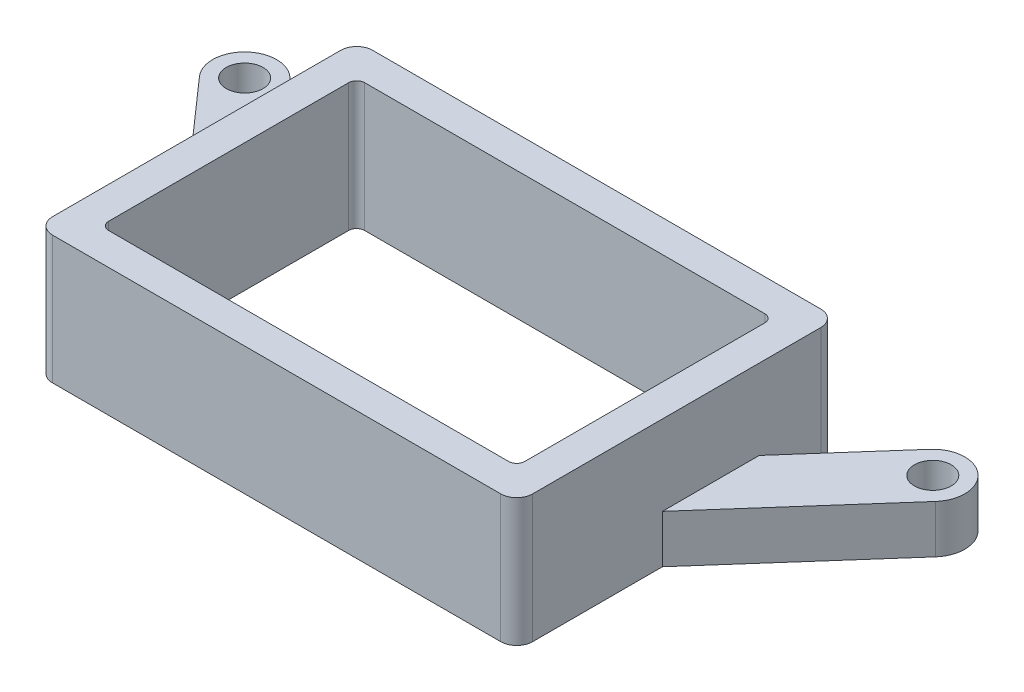
ISO-10303-21;
HEADER;
FILE_DESCRIPTION(('STEP AP214'),'2;1');
FILE_NAME('part.step','',(''),(''),'','','');
FILE_SCHEMA(('AUTOMOTIVE_DESIGN { 1 0 10303 214 1 1 1 1 }'));
ENDSEC;
DATA;
#1=APPLICATION_CONTEXT('core data for automotive mechanical design processes');
#2=APPLICATION_PROTOCOL_DEFINITION('international standard','automotive_design',2000,#1);
#3=PRODUCT_CONTEXT('',#1,'mechanical');
#4=PRODUCT('Part','Part','',(#3));
#5=PRODUCT_RELATED_PRODUCT_CATEGORY('part','',(#4));
#6=PRODUCT_DEFINITION_FORMATION('','',#4);
#7=PRODUCT_DEFINITION_CONTEXT('part definition',#1,'design');
#8=PRODUCT_DEFINITION('design','',#6,#7);
#9=PRODUCT_DEFINITION_SHAPE('','',#8);
#10=(LENGTH_UNIT() NAMED_UNIT(*) SI_UNIT(.MILLI.,.METRE.));
#11=(NAMED_UNIT(*) PLANE_ANGLE_UNIT() SI_UNIT($,.RADIAN.));
#12=(NAMED_UNIT(*) SI_UNIT($,.STERADIAN.) SOLID_ANGLE_UNIT());
#13=UNCERTAINTY_MEASURE_WITH_UNIT(LENGTH_MEASURE(1.E-05),#10,'distance_accuracy_value','');
#14=(GEOMETRIC_REPRESENTATION_CONTEXT(3) GLOBAL_UNCERTAINTY_ASSIGNED_CONTEXT((#13)) GLOBAL_UNIT_ASSIGNED_CONTEXT((#10,
#11,#12)) REPRESENTATION_CONTEXT('',''));
#15=CARTESIAN_POINT('',(0.,0.,0.));
#16=DIRECTION('',(0.,0.,1.));
#17=DIRECTION('',(1.,0.,0.));
#18=AXIS2_PLACEMENT_3D('',#15,#16,#17);
#19=CARTESIAN_POINT('',(0.,3.,0.));
#20=DIRECTION('',(0.,1.,0.));
#21=DIRECTION('',(0.,0.,1.));
#22=AXIS2_PLACEMENT_3D('',#19,#20,#21);
#23=PLANE('',#22);
#24=DIRECTION('',(0.,0.,-1.));
#25=VECTOR('',#24,1.);
#26=CARTESIAN_POINT('',(15.,3.,10.));
#27=LINE('',#26,#25);
#28=CARTESIAN_POINT('',(15.,3.,0.894023007753725));
#29=VERTEX_POINT('',#28);
#30=CARTESIAN_POINT('',(15.,3.,-5.15340856039392));
#31=VERTEX_POINT('',#30);
#32=EDGE_CURVE('E204',#29,#31,#27,.T.);
#33=ORIENTED_EDGE('',*,*,#32,.F.);
#34=DIRECTION('',(0.661437827766149,0.,-0.749999999999999));
#35=VECTOR('',#34,1.);
#36=CARTESIAN_POINT('',(8.88100547716616,3.,7.83231062826142));
#37=LINE('',#36,#35);
#38=CARTESIAN_POINT('',(23.,3.,-8.1771243444677));
#39=VERTEX_POINT('',#38);
#40=EDGE_CURVE('E207',#29,#39,#37,.T.);
#41=ORIENTED_EDGE('',*,*,#40,.T.);
#42=CARTESIAN_POINT('',(21.5,3.,-9.5));
#43=DIRECTION('',(0.,1.,0.));
#44=DIRECTION('',(0.,0.,1.));
#45=AXIS2_PLACEMENT_3D('',#42,#43,#44);
#46=CIRCLE('',#45,2.);
#47=CARTESIAN_POINT('',(20.,3.,-10.8228756555323));
#48=VERTEX_POINT('',#47);
#49=EDGE_CURVE('E226',#39,#48,#46,.T.);
#50=ORIENTED_EDGE('',*,*,#49,.T.);
#51=DIRECTION('',(0.661437827766149,0.,-0.749999999999999));
#52=VECTOR('',#51,1.);
#53=CARTESIAN_POINT('',(5.88100547716615,3.,5.18655931719682));
#54=LINE('',#53,#52);
#55=EDGE_CURVE('E210',#31,#48,#54,.T.);
#56=ORIENTED_EDGE('',*,*,#55,.F.);
#57=EDGE_LOOP('',(#33,#41,#50,#56));
#58=FACE_BOUND('',#57,.T.);
#59=CARTESIAN_POINT('',(21.5,3.,-9.5));
#60=DIRECTION('',(0.,1.,0.));
#61=DIRECTION('',(0.,0.,1.));
#62=AXIS2_PLACEMENT_3D('',#59,#60,#61);
#63=CIRCLE('',#62,1.14999999999999);
#64=CARTESIAN_POINT('',(21.5,3.,-8.35000000000001));
#65=VERTEX_POINT('',#64);
#66=EDGE_CURVE('E412',#65,#65,#63,.F.);
#67=ORIENTED_EDGE('',*,*,#66,.T.);
#68=EDGE_LOOP('',(#67));
#69=FACE_BOUND('',#68,.T.);
#70=ADVANCED_FACE('F41',(#58,#69),#23,.T.);
#71=CARTESIAN_POINT('',(0.,3.,10.));
#72=DIRECTION('',(0.,0.,1.));
#73=DIRECTION('',(1.,0.,0.));
#74=AXIS2_PLACEMENT_3D('',#71,#72,#73);
#75=PLANE('',#74);
#76=DIRECTION('',(-1.,0.,0.));
#77=VECTOR('',#76,1.);
#78=CARTESIAN_POINT('',(0.,0.,10.));
#79=LINE('',#78,#77);
#80=CARTESIAN_POINT('',(14.,0.,10.));
#81=VERTEX_POINT('',#80);
#82=CARTESIAN_POINT('',(-14.,0.,10.));
#83=VERTEX_POINT('',#82);
#84=EDGE_CURVE('E426',#81,#83,#79,.T.);
#85=ORIENTED_EDGE('',*,*,#84,.F.);
#86=DIRECTION('',(0.,-1.,0.));
#87=VECTOR('',#86,1.);
#88=CARTESIAN_POINT('',(14.,8.,10.));
#89=LINE('',#88,#87);
#90=CARTESIAN_POINT('',(14.,8.,10.));
#91=VERTEX_POINT('',#90);
#92=EDGE_CURVE('E265',#81,#91,#89,.F.);
#93=ORIENTED_EDGE('',*,*,#92,.T.);
#94=DIRECTION('',(1.,0.,0.));
#95=VECTOR('',#94,1.);
#96=CARTESIAN_POINT('',(15.,8.,10.));
#97=LINE('',#96,#95);
#98=CARTESIAN_POINT('',(-14.,8.,10.));
#99=VERTEX_POINT('',#98);
#100=EDGE_CURVE('E389',#99,#91,#97,.T.);
#101=ORIENTED_EDGE('',*,*,#100,.F.);
#102=DIRECTION('',(0.,-1.,0.));
#103=VECTOR('',#102,1.);
#104=CARTESIAN_POINT('',(-14.,3.,10.));
#105=LINE('',#104,#103);
#106=EDGE_CURVE('E261',#99,#83,#105,.T.);
#107=ORIENTED_EDGE('',*,*,#106,.T.);
#108=EDGE_LOOP('',(#85,#93,#101,#107));
#109=FACE_BOUND('',#108,.T.);
#110=ADVANCED_FACE('F541',(#109),#75,.T.);
#111=CARTESIAN_POINT('',(8.88100547716616,3.,7.83231062826142));
#112=DIRECTION('',(-0.749999999999999,0.,-0.661437827766149));
#113=DIRECTION('',(-0.661437827766149,0.,0.749999999999999));
#114=AXIS2_PLACEMENT_3D('',#111,#112,#113);
#115=PLANE('',#114);
#116=DIRECTION('',(0.661437827766149,0.,-0.749999999999999));
#117=VECTOR('',#116,1.);
#118=CARTESIAN_POINT('',(8.88100547716616,0.,7.83231062826142));
#119=LINE('',#118,#117);
#120=CARTESIAN_POINT('',(15.,0.,0.894023007753727));
#121=VERTEX_POINT('',#120);
#122=CARTESIAN_POINT('',(23.,0.,-8.1771243444677));
#123=VERTEX_POINT('',#122);
#124=EDGE_CURVE('E432',#121,#123,#119,.T.);
#125=ORIENTED_EDGE('',*,*,#124,.T.);
#126=DIRECTION('',(0.,-1.,0.));
#127=VECTOR('',#126,1.);
#128=CARTESIAN_POINT('',(23.,3.,-8.1771243444677));
#129=LINE('',#128,#127);
#130=EDGE_CURVE('E224',#39,#123,#129,.T.);
#131=ORIENTED_EDGE('',*,*,#130,.F.);
#132=ORIENTED_EDGE('',*,*,#40,.F.);
#133=DIRECTION('',(0.,-1.,0.));
#134=VECTOR('',#133,1.);
#135=CARTESIAN_POINT('',(15.,3.,0.894023007753727));
#136=LINE('',#135,#134);
#137=EDGE_CURVE('E222',#29,#121,#136,.T.);
#138=ORIENTED_EDGE('',*,*,#137,.T.);
#139=EDGE_LOOP('',(#125,#131,#132,#138));
#140=FACE_BOUND('',#139,.T.);
#141=ADVANCED_FACE('F221',(#140),#115,.F.);
#142=CARTESIAN_POINT('',(21.5,3.,-9.5));
#143=DIRECTION('',(0.,-1.,0.));
#144=DIRECTION('',(0.,0.,-1.));
#145=AXIS2_PLACEMENT_3D('',#142,#143,#144);
#146=CYLINDRICAL_SURFACE('',#145,2.);
#147=CARTESIAN_POINT('',(21.5,0.,-9.5));
#148=DIRECTION('',(0.,1.,0.));
#149=DIRECTION('',(0.,0.,1.));
#150=AXIS2_PLACEMENT_3D('',#147,#148,#149);
#151=CIRCLE('',#150,2.);
#152=CARTESIAN_POINT('',(20.,0.,-10.8228756555323));
#153=VERTEX_POINT('',#152);
#154=EDGE_CURVE('E436',#123,#153,#151,.T.);
#155=ORIENTED_EDGE('',*,*,#154,.T.);
#156=DIRECTION('',(0.,-1.,0.));
#157=VECTOR('',#156,1.);
#158=CARTESIAN_POINT('',(20.,3.,-10.8228756555323));
#159=LINE('',#158,#157);
#160=EDGE_CURVE('E240',#48,#153,#159,.T.);
#161=ORIENTED_EDGE('',*,*,#160,.F.);
#162=ORIENTED_EDGE('',*,*,#49,.F.);
#163=ORIENTED_EDGE('',*,*,#130,.T.);
#164=EDGE_LOOP('',(#155,#161,#162,#163));
#165=FACE_BOUND('',#164,.T.);
#166=ADVANCED_FACE('F492',(#165),#146,.T.);
#167=CARTESIAN_POINT('',(5.88100547716615,3.,5.18655931719682));
#168=DIRECTION('',(-0.749999999999999,0.,-0.661437827766149));
#169=DIRECTION('',(-0.661437827766149,0.,0.749999999999999));
#170=AXIS2_PLACEMENT_3D('',#167,#168,#169);
#171=PLANE('',#170);
#172=DIRECTION('',(0.661437827766149,0.,-0.749999999999999));
#173=VECTOR('',#172,1.);
#174=CARTESIAN_POINT('',(5.88100547716615,0.,5.18655931719682));
#175=LINE('',#174,#173);
#176=CARTESIAN_POINT('',(15.,0.,-5.15340856039392));
#177=VERTEX_POINT('',#176);
#178=EDGE_CURVE('E440',#177,#153,#175,.T.);
#179=ORIENTED_EDGE('',*,*,#178,.F.);
#180=DIRECTION('',(0.,-1.,0.));
#181=VECTOR('',#180,1.);
#182=CARTESIAN_POINT('',(15.,3.,-5.15340856039392));
#183=LINE('',#182,#181);
#184=EDGE_CURVE('E484',#31,#177,#183,.T.);
#185=ORIENTED_EDGE('',*,*,#184,.F.);
#186=ORIENTED_EDGE('',*,*,#55,.T.);
#187=ORIENTED_EDGE('',*,*,#160,.T.);
#188=EDGE_LOOP('',(#179,#185,#186,#187));
#189=FACE_BOUND('',#188,.T.);
#190=ADVANCED_FACE('F490',(#189),#171,.T.);
#191=CARTESIAN_POINT('',(15.,3.,0.));
#192=DIRECTION('',(-1.,0.,0.));
#193=DIRECTION('',(0.,0.,1.));
#194=AXIS2_PLACEMENT_3D('',#191,#192,#193);
#195=PLANE('',#194);
#196=DIRECTION('',(0.,0.,-1.));
#197=VECTOR('',#196,1.);
#198=CARTESIAN_POINT('',(15.,8.,10.));
#199=LINE('',#198,#197);
#200=CARTESIAN_POINT('',(15.,8.,9.));
#201=VERTEX_POINT('',#200);
#202=CARTESIAN_POINT('',(15.,8.,-9.00000000000001));
#203=VERTEX_POINT('',#202);
#204=EDGE_CURVE('E377',#201,#203,#199,.T.);
#205=ORIENTED_EDGE('',*,*,#204,.F.);
#206=DIRECTION('',(0.,-1.,0.));
#207=VECTOR('',#206,1.);
#208=CARTESIAN_POINT('',(15.,0.,9.));
#209=LINE('',#208,#207);
#210=CARTESIAN_POINT('',(15.,0.,9.));
#211=VERTEX_POINT('',#210);
#212=EDGE_CURVE('E246',#201,#211,#209,.T.);
#213=ORIENTED_EDGE('',*,*,#212,.T.);
#214=DIRECTION('',(0.,0.,-1.));
#215=VECTOR('',#214,1.);
#216=CARTESIAN_POINT('',(15.,0.,0.));
#217=LINE('',#216,#215);
#218=EDGE_CURVE('E233',#211,#121,#217,.T.);
#219=ORIENTED_EDGE('',*,*,#218,.T.);
#220=ORIENTED_EDGE('',*,*,#137,.F.);
#221=ORIENTED_EDGE('',*,*,#32,.T.);
#222=ORIENTED_EDGE('',*,*,#184,.T.);
#223=CARTESIAN_POINT('',(15.,0.,-9.00000000000001));
#224=VERTEX_POINT('',#223);
#225=EDGE_CURVE('E433',#177,#224,#217,.T.);
#226=ORIENTED_EDGE('',*,*,#225,.T.);
#227=DIRECTION('',(0.,-1.,0.));
#228=VECTOR('',#227,1.);
#229=CARTESIAN_POINT('',(15.,3.,-9.00000000000001));
#230=LINE('',#229,#228);
#231=EDGE_CURVE('E215',#224,#203,#230,.F.);
#232=ORIENTED_EDGE('',*,*,#231,.T.);
#233=EDGE_LOOP('',(#205,#213,#219,#220,#221,#222,#226,#232));
#234=FACE_BOUND('',#233,.T.);
#235=ADVANCED_FACE('F230',(#234),#195,.F.);
#236=CARTESIAN_POINT('',(0.,3.,-10.));
#237=DIRECTION('',(0.,0.,1.));
#238=DIRECTION('',(1.,0.,0.));
#239=AXIS2_PLACEMENT_3D('',#236,#237,#238);
#240=PLANE('',#239);
#241=DIRECTION('',(-1.,0.,0.));
#242=VECTOR('',#241,1.);
#243=CARTESIAN_POINT('',(15.,8.,-10.));
#244=LINE('',#243,#242);
#245=CARTESIAN_POINT('',(14.,8.,-10.));
#246=VERTEX_POINT('',#245);
#247=CARTESIAN_POINT('',(-14.,8.,-10.));
#248=VERTEX_POINT('',#247);
#249=EDGE_CURVE('E381',#246,#248,#244,.T.);
#250=ORIENTED_EDGE('',*,*,#249,.F.);
#251=DIRECTION('',(0.,-1.,0.));
#252=VECTOR('',#251,1.);
#253=CARTESIAN_POINT('',(14.,3.,-10.));
#254=LINE('',#253,#252);
#255=CARTESIAN_POINT('',(14.,0.,-10.));
#256=VERTEX_POINT('',#255);
#257=EDGE_CURVE('E283',#246,#256,#254,.T.);
#258=ORIENTED_EDGE('',*,*,#257,.T.);
#259=DIRECTION('',(-1.,0.,0.));
#260=VECTOR('',#259,1.);
#261=CARTESIAN_POINT('',(0.,0.,-10.));
#262=LINE('',#261,#260);
#263=CARTESIAN_POINT('',(-14.,0.,-10.));
#264=VERTEX_POINT('',#263);
#265=EDGE_CURVE('E444',#256,#264,#262,.T.);
#266=ORIENTED_EDGE('',*,*,#265,.T.);
#267=DIRECTION('',(0.,-1.,0.));
#268=VECTOR('',#267,1.);
#269=CARTESIAN_POINT('',(-14.,8.,-10.));
#270=LINE('',#269,#268);
#271=EDGE_CURVE('E280',#264,#248,#270,.F.);
#272=ORIENTED_EDGE('',*,*,#271,.T.);
#273=EDGE_LOOP('',(#250,#258,#266,#272));
#274=FACE_BOUND('',#273,.T.);
#275=ADVANCED_FACE('F527',(#274),#240,.F.);
#276=CARTESIAN_POINT('',(-5.88100547716615,3.,5.18655931719681));
#277=DIRECTION('',(-0.749999999999998,0.,0.661437827766149));
#278=DIRECTION('',(0.661437827766149,0.,0.749999999999999));
#279=AXIS2_PLACEMENT_3D('',#276,#277,#278);
#280=PLANE('',#279);
#281=DIRECTION('',(-0.661437827766149,0.,-0.749999999999999));
#282=VECTOR('',#281,1.);
#283=CARTESIAN_POINT('',(-5.88100547716615,0.,5.18655931719681));
#284=LINE('',#283,#282);
#285=CARTESIAN_POINT('',(-15.,0.,-5.15340856039393));
#286=VERTEX_POINT('',#285);
#287=CARTESIAN_POINT('',(-20.,0.,-10.8228756555323));
#288=VERTEX_POINT('',#287);
#289=EDGE_CURVE('E452',#286,#288,#284,.T.);
#290=ORIENTED_EDGE('',*,*,#289,.T.);
#291=DIRECTION('',(0.,-1.,0.));
#292=VECTOR('',#291,1.);
#293=CARTESIAN_POINT('',(-20.,3.,-10.8228756555323));
#294=LINE('',#293,#292);
#295=CARTESIAN_POINT('',(-20.,3.,-10.8228756555323));
#296=VERTEX_POINT('',#295);
#297=EDGE_CURVE('E478',#296,#288,#294,.T.);
#298=ORIENTED_EDGE('',*,*,#297,.F.);
#299=DIRECTION('',(-0.661437827766149,0.,-0.749999999999999));
#300=VECTOR('',#299,1.);
#301=CARTESIAN_POINT('',(-5.88100547716615,3.,5.18655931719681));
#302=LINE('',#301,#300);
#303=CARTESIAN_POINT('',(-15.,3.,-5.15340856039393));
#304=VERTEX_POINT('',#303);
#305=EDGE_CURVE('E397',#304,#296,#302,.T.);
#306=ORIENTED_EDGE('',*,*,#305,.F.);
#307=DIRECTION('',(0.,-1.,0.));
#308=VECTOR('',#307,1.);
#309=CARTESIAN_POINT('',(-15.,3.,-5.15340856039393));
#310=LINE('',#309,#308);
#311=EDGE_CURVE('E481',#304,#286,#310,.T.);
#312=ORIENTED_EDGE('',*,*,#311,.T.);
#313=EDGE_LOOP('',(#290,#298,#306,#312));
#314=FACE_BOUND('',#313,.T.);
#315=ADVANCED_FACE('F599',(#314),#280,.F.);
#316=CARTESIAN_POINT('',(-21.5,3.,-9.5));
#317=DIRECTION('',(0.,-1.,0.));
#318=DIRECTION('',(0.,0.,-1.));
#319=AXIS2_PLACEMENT_3D('',#316,#317,#318);
#320=CYLINDRICAL_SURFACE('',#319,2.);
#321=CARTESIAN_POINT('',(-21.5,0.,-9.5));
#322=DIRECTION('',(0.,1.,0.));
#323=DIRECTION('',(0.,0.,1.));
#324=AXIS2_PLACEMENT_3D('',#321,#322,#323);
#325=CIRCLE('',#324,2.);
#326=CARTESIAN_POINT('',(-23.,0.,-8.1771243444677));
#327=VERTEX_POINT('',#326);
#328=EDGE_CURVE('E457',#327,#288,#325,.F.);
#329=ORIENTED_EDGE('',*,*,#328,.F.);
#330=DIRECTION('',(0.,-1.,0.));
#331=VECTOR('',#330,1.);
#332=CARTESIAN_POINT('',(-23.,3.,-8.1771243444677));
#333=LINE('',#332,#331);
#334=CARTESIAN_POINT('',(-23.,3.,-8.1771243444677));
#335=VERTEX_POINT('',#334);
#336=EDGE_CURVE('E475',#335,#327,#333,.T.);
#337=ORIENTED_EDGE('',*,*,#336,.F.);
#338=CARTESIAN_POINT('',(-21.5,3.,-9.5));
#339=DIRECTION('',(0.,1.,0.));
#340=DIRECTION('',(0.,0.,1.));
#341=AXIS2_PLACEMENT_3D('',#338,#339,#340);
#342=CIRCLE('',#341,2.);
#343=EDGE_CURVE('E400',#335,#296,#342,.F.);
#344=ORIENTED_EDGE('',*,*,#343,.T.);
#345=ORIENTED_EDGE('',*,*,#297,.T.);
#346=EDGE_LOOP('',(#329,#337,#344,#345));
#347=FACE_BOUND('',#346,.T.);
#348=ADVANCED_FACE('F514',(#347),#320,.T.);
#349=CARTESIAN_POINT('',(-8.88100547716616,3.,7.83231062826142));
#350=DIRECTION('',(-0.749999999999999,0.,0.661437827766149));
#351=DIRECTION('',(0.661437827766149,0.,0.749999999999999));
#352=AXIS2_PLACEMENT_3D('',#349,#350,#351);
#353=PLANE('',#352);
#354=DIRECTION('',(-0.661437827766149,0.,-0.749999999999999));
#355=VECTOR('',#354,1.);
#356=CARTESIAN_POINT('',(-8.88100547716616,0.,7.83231062826142));
#357=LINE('',#356,#355);
#358=CARTESIAN_POINT('',(-15.,0.,0.894023007753716));
#359=VERTEX_POINT('',#358);
#360=EDGE_CURVE('E461',#359,#327,#357,.T.);
#361=ORIENTED_EDGE('',*,*,#360,.F.);
#362=DIRECTION('',(0.,-1.,0.));
#363=VECTOR('',#362,1.);
#364=CARTESIAN_POINT('',(-15.,3.,0.894023007753716));
#365=LINE('',#364,#363);
#366=CARTESIAN_POINT('',(-15.,3.,0.894023007753716));
#367=VERTEX_POINT('',#366);
#368=EDGE_CURVE('E416',#367,#359,#365,.T.);
#369=ORIENTED_EDGE('',*,*,#368,.F.);
#370=DIRECTION('',(-0.661437827766149,0.,-0.749999999999999));
#371=VECTOR('',#370,1.);
#372=CARTESIAN_POINT('',(-8.88100547716616,3.,7.83231062826142));
#373=LINE('',#372,#371);
#374=EDGE_CURVE('E404',#367,#335,#373,.T.);
#375=ORIENTED_EDGE('',*,*,#374,.T.);
#376=ORIENTED_EDGE('',*,*,#336,.T.);
#377=EDGE_LOOP('',(#361,#369,#375,#376));
#378=FACE_BOUND('',#377,.T.);
#379=ADVANCED_FACE('F510',(#378),#353,.T.);
#380=CARTESIAN_POINT('',(0.,3.,8.));
#381=DIRECTION('',(0.,0.,1.));
#382=DIRECTION('',(1.,0.,0.));
#383=AXIS2_PLACEMENT_3D('',#380,#381,#382);
#384=PLANE('',#383);
#385=DIRECTION('',(1.,0.,0.));
#386=VECTOR('',#385,1.);
#387=CARTESIAN_POINT('',(13.,8.,8.));
#388=LINE('',#387,#386);
#389=CARTESIAN_POINT('',(-12.5,8.,8.));
#390=VERTEX_POINT('',#389);
#391=CARTESIAN_POINT('',(12.5,8.,8.));
#392=VERTEX_POINT('',#391);
#393=EDGE_CURVE('E369',#390,#392,#388,.T.);
#394=ORIENTED_EDGE('',*,*,#393,.T.);
#395=DIRECTION('',(0.,-1.,0.));
#396=VECTOR('',#395,1.);
#397=CARTESIAN_POINT('',(12.5,3.,8.));
#398=LINE('',#397,#396);
#399=CARTESIAN_POINT('',(12.5,0.,8.));
#400=VERTEX_POINT('',#399);
#401=EDGE_CURVE('E297',#392,#400,#398,.T.);
#402=ORIENTED_EDGE('',*,*,#401,.T.);
#403=DIRECTION('',(-1.,0.,0.));
#404=VECTOR('',#403,1.);
#405=CARTESIAN_POINT('',(0.,0.,8.));
#406=LINE('',#405,#404);
#407=CARTESIAN_POINT('',(-12.5,0.,8.));
#408=VERTEX_POINT('',#407);
#409=EDGE_CURVE('E352',#400,#408,#406,.T.);
#410=ORIENTED_EDGE('',*,*,#409,.T.);
#411=DIRECTION('',(0.,-1.,0.));
#412=VECTOR('',#411,1.);
#413=CARTESIAN_POINT('',(-12.5,8.,8.));
#414=LINE('',#413,#412);
#415=EDGE_CURVE('E294',#408,#390,#414,.F.);
#416=ORIENTED_EDGE('',*,*,#415,.T.);
#417=EDGE_LOOP('',(#394,#402,#410,#416));
#418=FACE_BOUND('',#417,.T.);
#419=ADVANCED_FACE('F596',(#418),#384,.F.);
#420=CARTESIAN_POINT('',(-13.,3.,0.));
#421=DIRECTION('',(-1.,0.,0.));
#422=DIRECTION('',(0.,0.,1.));
#423=AXIS2_PLACEMENT_3D('',#420,#421,#422);
#424=PLANE('',#423);
#425=DIRECTION('',(0.,0.,1.));
#426=VECTOR('',#425,1.);
#427=CARTESIAN_POINT('',(-13.,8.,8.));
#428=LINE('',#427,#426);
#429=CARTESIAN_POINT('',(-13.,8.,-7.5));
#430=VERTEX_POINT('',#429);
#431=CARTESIAN_POINT('',(-13.,8.,7.5));
#432=VERTEX_POINT('',#431);
#433=EDGE_CURVE('E360',#430,#432,#428,.T.);
#434=ORIENTED_EDGE('',*,*,#433,.T.);
#435=DIRECTION('',(0.,-1.,0.));
#436=VECTOR('',#435,1.);
#437=CARTESIAN_POINT('',(-13.,0.,7.5));
#438=LINE('',#437,#436);
#439=CARTESIAN_POINT('',(-13.,0.,7.5));
#440=VERTEX_POINT('',#439);
#441=EDGE_CURVE('E317',#432,#440,#438,.T.);
#442=ORIENTED_EDGE('',*,*,#441,.T.);
#443=DIRECTION('',(0.,0.,-1.));
#444=VECTOR('',#443,1.);
#445=CARTESIAN_POINT('',(-13.,0.,0.));
#446=LINE('',#445,#444);
#447=CARTESIAN_POINT('',(-13.,0.,-7.5));
#448=VERTEX_POINT('',#447);
#449=EDGE_CURVE('E344',#440,#448,#446,.T.);
#450=ORIENTED_EDGE('',*,*,#449,.T.);
#451=DIRECTION('',(0.,-1.,0.));
#452=VECTOR('',#451,1.);
#453=CARTESIAN_POINT('',(-13.,3.,-7.5));
#454=LINE('',#453,#452);
#455=EDGE_CURVE('E64',#448,#430,#454,.F.);
#456=ORIENTED_EDGE('',*,*,#455,.T.);
#457=EDGE_LOOP('',(#434,#442,#450,#456));
#458=FACE_BOUND('',#457,.T.);
#459=ADVANCED_FACE('F349',(#458),#424,.F.);
#460=CARTESIAN_POINT('',(0.,3.,-8.));
#461=DIRECTION('',(0.,0.,1.));
#462=DIRECTION('',(1.,0.,0.));
#463=AXIS2_PLACEMENT_3D('',#460,#461,#462);
#464=PLANE('',#463);
#465=DIRECTION('',(-1.,0.,0.));
#466=VECTOR('',#465,1.);
#467=CARTESIAN_POINT('',(0.,0.,-8.));
#468=LINE('',#467,#466);
#469=CARTESIAN_POINT('',(12.5,0.,-8.));
#470=VERTEX_POINT('',#469);
#471=CARTESIAN_POINT('',(-12.5,0.,-8.));
#472=VERTEX_POINT('',#471);
#473=EDGE_CURVE('E346',#470,#472,#468,.T.);
#474=ORIENTED_EDGE('',*,*,#473,.F.);
#475=DIRECTION('',(0.,-1.,0.));
#476=VECTOR('',#475,1.);
#477=CARTESIAN_POINT('',(12.5,8.,-8.));
#478=LINE('',#477,#476);
#479=CARTESIAN_POINT('',(12.5,8.,-8.));
#480=VERTEX_POINT('',#479);
#481=EDGE_CURVE('E312',#470,#480,#478,.F.);
#482=ORIENTED_EDGE('',*,*,#481,.T.);
#483=DIRECTION('',(-1.,0.,0.));
#484=VECTOR('',#483,1.);
#485=CARTESIAN_POINT('',(13.,8.,-8.));
#486=LINE('',#485,#484);
#487=CARTESIAN_POINT('',(-12.5,8.,-8.));
#488=VERTEX_POINT('',#487);
#489=EDGE_CURVE('E358',#480,#488,#486,.T.);
#490=ORIENTED_EDGE('',*,*,#489,.T.);
#491=DIRECTION('',(0.,-1.,0.));
#492=VECTOR('',#491,1.);
#493=CARTESIAN_POINT('',(-12.5,3.,-8.));
#494=LINE('',#493,#492);
#495=EDGE_CURVE('E308',#488,#472,#494,.T.);
#496=ORIENTED_EDGE('',*,*,#495,.T.);
#497=EDGE_LOOP('',(#474,#482,#490,#496));
#498=FACE_BOUND('',#497,.T.);
#499=ADVANCED_FACE('F362',(#498),#464,.T.);
#500=CARTESIAN_POINT('',(-21.5,3.,-9.5));
#501=DIRECTION('',(0.,-1.,0.));
#502=DIRECTION('',(0.,0.,-1.));
#503=AXIS2_PLACEMENT_3D('',#500,#501,#502);
#504=CYLINDRICAL_SURFACE('',#503,1.15);
#505=CARTESIAN_POINT('',(-21.5,3.,-9.5));
#506=DIRECTION('',(0.,1.,0.));
#507=DIRECTION('',(0.,0.,1.));
#508=AXIS2_PLACEMENT_3D('',#505,#506,#507);
#509=CIRCLE('',#508,1.15);
#510=CARTESIAN_POINT('',(-21.5,3.,-8.35));
#511=VERTEX_POINT('',#510);
#512=EDGE_CURVE('E408',#511,#511,#509,.T.);
#513=ORIENTED_EDGE('',*,*,#512,.T.);
#514=EDGE_LOOP('',(#513));
#515=FACE_BOUND('',#514,.T.);
#516=CARTESIAN_POINT('',(-21.5,0.,-9.5));
#517=DIRECTION('',(0.,1.,0.));
#518=DIRECTION('',(0.,0.,1.));
#519=AXIS2_PLACEMENT_3D('',#516,#517,#518);
#520=CIRCLE('',#519,1.15);
#521=CARTESIAN_POINT('',(-21.5,0.,-8.35));
#522=VERTEX_POINT('',#521);
#523=EDGE_CURVE('E465',#522,#522,#520,.T.);
#524=ORIENTED_EDGE('',*,*,#523,.F.);
#525=EDGE_LOOP('',(#524));
#526=FACE_BOUND('',#525,.T.);
#527=ADVANCED_FACE('F579',(#515,#526),#504,.F.);
#528=CARTESIAN_POINT('',(-15.,3.,0.));
#529=DIRECTION('',(-1.,0.,0.));
#530=DIRECTION('',(0.,0.,1.));
#531=AXIS2_PLACEMENT_3D('',#528,#529,#530);
#532=PLANE('',#531);
#533=DIRECTION('',(0.,0.,1.));
#534=VECTOR('',#533,1.);
#535=CARTESIAN_POINT('',(-15.,8.,10.));
#536=LINE('',#535,#534);
#537=CARTESIAN_POINT('',(-15.,8.,-9.00000000000001));
#538=VERTEX_POINT('',#537);
#539=CARTESIAN_POINT('',(-15.,8.,9.));
#540=VERTEX_POINT('',#539);
#541=EDGE_CURVE('E385',#538,#540,#536,.T.);
#542=ORIENTED_EDGE('',*,*,#541,.F.);
#543=DIRECTION('',(0.,-1.,0.));
#544=VECTOR('',#543,1.);
#545=CARTESIAN_POINT('',(-15.,0.,-9.00000000000001));
#546=LINE('',#545,#544);
#547=CARTESIAN_POINT('',(-15.,0.,-9.00000000000001));
#548=VERTEX_POINT('',#547);
#549=EDGE_CURVE('E290',#538,#548,#546,.T.);
#550=ORIENTED_EDGE('',*,*,#549,.T.);
#551=DIRECTION('',(0.,0.,-1.));
#552=VECTOR('',#551,1.);
#553=CARTESIAN_POINT('',(-15.,0.,0.));
#554=LINE('',#553,#552);
#555=EDGE_CURVE('E448',#286,#548,#554,.T.);
#556=ORIENTED_EDGE('',*,*,#555,.F.);
#557=ORIENTED_EDGE('',*,*,#311,.F.);
#558=DIRECTION('',(0.,0.,1.));
#559=VECTOR('',#558,1.);
#560=CARTESIAN_POINT('',(-15.,3.,10.));
#561=LINE('',#560,#559);
#562=EDGE_CURVE('E216',#304,#367,#561,.T.);
#563=ORIENTED_EDGE('',*,*,#562,.T.);
#564=ORIENTED_EDGE('',*,*,#368,.T.);
#565=CARTESIAN_POINT('',(-15.,0.,9.));
#566=VERTEX_POINT('',#565);
#567=EDGE_CURVE('E453',#566,#359,#554,.T.);
#568=ORIENTED_EDGE('',*,*,#567,.F.);
#569=DIRECTION('',(0.,-1.,0.));
#570=VECTOR('',#569,1.);
#571=CARTESIAN_POINT('',(-15.,3.,9.));
#572=LINE('',#571,#570);
#573=EDGE_CURVE('E287',#566,#540,#572,.F.);
#574=ORIENTED_EDGE('',*,*,#573,.T.);
#575=EDGE_LOOP('',(#542,#550,#556,#557,#563,#564,#568,#574));
#576=FACE_BOUND('',#575,.T.);
#577=ADVANCED_FACE('F506',(#576),#532,.T.);
#578=CARTESIAN_POINT('',(13.,3.,0.));
#579=DIRECTION('',(-1.,0.,0.));
#580=DIRECTION('',(0.,0.,1.));
#581=AXIS2_PLACEMENT_3D('',#578,#579,#580);
#582=PLANE('',#581);
#583=DIRECTION('',(0.,0.,-1.));
#584=VECTOR('',#583,1.);
#585=CARTESIAN_POINT('',(13.,0.,0.));
#586=LINE('',#585,#584);
#587=CARTESIAN_POINT('',(13.,0.,7.5));
#588=VERTEX_POINT('',#587);
#589=CARTESIAN_POINT('',(13.,0.,-7.5));
#590=VERTEX_POINT('',#589);
#591=EDGE_CURVE('E422',#588,#590,#586,.T.);
#592=ORIENTED_EDGE('',*,*,#591,.F.);
#593=DIRECTION('',(0.,-1.,0.));
#594=VECTOR('',#593,1.);
#595=CARTESIAN_POINT('',(13.,3.,7.5));
#596=LINE('',#595,#594);
#597=CARTESIAN_POINT('',(13.,8.,7.5));
#598=VERTEX_POINT('',#597);
#599=EDGE_CURVE('E305',#588,#598,#596,.F.);
#600=ORIENTED_EDGE('',*,*,#599,.T.);
#601=DIRECTION('',(0.,0.,-1.));
#602=VECTOR('',#601,1.);
#603=CARTESIAN_POINT('',(13.,8.,8.));
#604=LINE('',#603,#602);
#605=CARTESIAN_POINT('',(13.,8.,-7.5));
#606=VERTEX_POINT('',#605);
#607=EDGE_CURVE('E365',#598,#606,#604,.T.);
#608=ORIENTED_EDGE('',*,*,#607,.T.);
#609=DIRECTION('',(0.,-1.,0.));
#610=VECTOR('',#609,1.);
#611=CARTESIAN_POINT('',(13.,0.,-7.5));
#612=LINE('',#611,#610);
#613=EDGE_CURVE('E301',#606,#590,#612,.T.);
#614=ORIENTED_EDGE('',*,*,#613,.T.);
#615=EDGE_LOOP('',(#592,#600,#608,#614));
#616=FACE_BOUND('',#615,.T.);
#617=ADVANCED_FACE('F573',(#616),#582,.T.);
#618=CARTESIAN_POINT('',(21.5,3.,-9.5));
#619=DIRECTION('',(0.,-1.,0.));
#620=DIRECTION('',(0.,0.,-1.));
#621=AXIS2_PLACEMENT_3D('',#618,#619,#620);
#622=CYLINDRICAL_SURFACE('',#621,1.14999999999999);
#623=ORIENTED_EDGE('',*,*,#66,.F.);
#624=EDGE_LOOP('',(#623));
#625=FACE_BOUND('',#624,.T.);
#626=CARTESIAN_POINT('',(21.5,0.,-9.5));
#627=DIRECTION('',(0.,1.,0.));
#628=DIRECTION('',(0.,0.,1.));
#629=AXIS2_PLACEMENT_3D('',#626,#627,#628);
#630=CIRCLE('',#629,1.14999999999999);
#631=CARTESIAN_POINT('',(21.5,0.,-8.35000000000001));
#632=VERTEX_POINT('',#631);
#633=EDGE_CURVE('E227',#632,#632,#630,.F.);
#634=ORIENTED_EDGE('',*,*,#633,.T.);
#635=EDGE_LOOP('',(#634));
#636=FACE_BOUND('',#635,.T.);
#637=ADVANCED_FACE('F567',(#625,#636),#622,.F.);
#638=ORIENTED_EDGE('',*,*,#562,.F.);
#639=ORIENTED_EDGE('',*,*,#305,.T.);
#640=ORIENTED_EDGE('',*,*,#343,.F.);
#641=ORIENTED_EDGE('',*,*,#374,.F.);
#642=EDGE_LOOP('',(#638,#639,#640,#641));
#643=FACE_BOUND('',#642,.T.);
#644=ORIENTED_EDGE('',*,*,#512,.F.);
#645=EDGE_LOOP('',(#644));
#646=FACE_BOUND('',#645,.T.);
#647=ADVANCED_FACE('F559',(#643,#646),#23,.T.);
#648=CARTESIAN_POINT('',(0.,0.,0.));
#649=DIRECTION('',(0.,1.,0.));
#650=DIRECTION('',(0.,0.,1.));
#651=AXIS2_PLACEMENT_3D('',#648,#649,#650);
#652=PLANE('',#651);
#653=ORIENTED_EDGE('',*,*,#409,.F.);
#654=CARTESIAN_POINT('',(12.5,0.,7.5));
#655=DIRECTION('',(0.,1.,0.));
#656=DIRECTION('',(0.,0.,1.));
#657=AXIS2_PLACEMENT_3D('',#654,#655,#656);
#658=CIRCLE('',#657,0.5);
#659=EDGE_CURVE('E321',#400,#588,#658,.T.);
#660=ORIENTED_EDGE('',*,*,#659,.T.);
#661=ORIENTED_EDGE('',*,*,#591,.T.);
#662=CARTESIAN_POINT('',(12.5,0.,-7.5));
#663=DIRECTION('',(0.,1.,0.));
#664=DIRECTION('',(0.,0.,1.));
#665=AXIS2_PLACEMENT_3D('',#662,#663,#664);
#666=CIRCLE('',#665,0.5);
#667=EDGE_CURVE('E327',#590,#470,#666,.T.);
#668=ORIENTED_EDGE('',*,*,#667,.T.);
#669=ORIENTED_EDGE('',*,*,#473,.T.);
#670=CARTESIAN_POINT('',(-12.5,0.,-7.5));
#671=DIRECTION('',(0.,1.,0.));
#672=DIRECTION('',(0.,0.,1.));
#673=AXIS2_PLACEMENT_3D('',#670,#671,#672);
#674=CIRCLE('',#673,0.5);
#675=EDGE_CURVE('E50',#472,#448,#674,.T.);
#676=ORIENTED_EDGE('',*,*,#675,.T.);
#677=ORIENTED_EDGE('',*,*,#449,.F.);
#678=CARTESIAN_POINT('',(-12.5,0.,7.5));
#679=DIRECTION('',(0.,1.,0.));
#680=DIRECTION('',(0.,0.,1.));
#681=AXIS2_PLACEMENT_3D('',#678,#679,#680);
#682=CIRCLE('',#681,0.5);
#683=EDGE_CURVE('E333',#440,#408,#682,.T.);
#684=ORIENTED_EDGE('',*,*,#683,.T.);
#685=EDGE_LOOP('',(#653,#660,#661,#668,#669,#676,#677,#684));
#686=FACE_BOUND('',#685,.T.);
#687=ORIENTED_EDGE('',*,*,#218,.F.);
#688=CARTESIAN_POINT('',(14.,0.,9.));
#689=DIRECTION('',(0.,1.,0.));
#690=DIRECTION('',(0.,0.,1.));
#691=AXIS2_PLACEMENT_3D('',#688,#689,#690);
#692=CIRCLE('',#691,1.);
#693=EDGE_CURVE('E258',#211,#81,#692,.F.);
#694=ORIENTED_EDGE('',*,*,#693,.T.);
#695=ORIENTED_EDGE('',*,*,#84,.T.);
#696=CARTESIAN_POINT('',(-14.,0.,9.));
#697=DIRECTION('',(0.,1.,0.));
#698=DIRECTION('',(0.,0.,1.));
#699=AXIS2_PLACEMENT_3D('',#696,#697,#698);
#700=CIRCLE('',#699,1.);
#701=EDGE_CURVE('E249',#83,#566,#700,.F.);
#702=ORIENTED_EDGE('',*,*,#701,.T.);
#703=ORIENTED_EDGE('',*,*,#567,.T.);
#704=ORIENTED_EDGE('',*,*,#360,.T.);
#705=ORIENTED_EDGE('',*,*,#328,.T.);
#706=ORIENTED_EDGE('',*,*,#289,.F.);
#707=ORIENTED_EDGE('',*,*,#555,.T.);
#708=CARTESIAN_POINT('',(-14.,0.,-9.00000000000001));
#709=DIRECTION('',(0.,1.,0.));
#710=DIRECTION('',(0.,0.,1.));
#711=AXIS2_PLACEMENT_3D('',#708,#709,#710);
#712=CIRCLE('',#711,1.);
#713=EDGE_CURVE('E252',#548,#264,#712,.F.);
#714=ORIENTED_EDGE('',*,*,#713,.T.);
#715=ORIENTED_EDGE('',*,*,#265,.F.);
#716=CARTESIAN_POINT('',(14.,0.,-9.00000000000001));
#717=DIRECTION('',(0.,1.,0.));
#718=DIRECTION('',(0.,0.,1.));
#719=AXIS2_PLACEMENT_3D('',#716,#717,#718);
#720=CIRCLE('',#719,1.);
#721=EDGE_CURVE('E255',#256,#224,#720,.F.);
#722=ORIENTED_EDGE('',*,*,#721,.T.);
#723=ORIENTED_EDGE('',*,*,#225,.F.);
#724=ORIENTED_EDGE('',*,*,#178,.T.);
#725=ORIENTED_EDGE('',*,*,#154,.F.);
#726=ORIENTED_EDGE('',*,*,#124,.F.);
#727=EDGE_LOOP('',(#687,#694,#695,#702,#703,#704,#705,#706,#707,#714,#715,#722,#723,#724,#725,#726));
#728=FACE_BOUND('',#727,.T.);
#729=ORIENTED_EDGE('',*,*,#523,.T.);
#730=EDGE_LOOP('',(#729));
#731=FACE_BOUND('',#730,.T.);
#732=ORIENTED_EDGE('',*,*,#633,.F.);
#733=EDGE_LOOP('',(#732));
#734=FACE_BOUND('',#733,.T.);
#735=ADVANCED_FACE('F342',(#686,#728,#731,#734),#652,.F.);
#736=CARTESIAN_POINT('',(0.,8.,0.));
#737=DIRECTION('',(0.,1.,0.));
#738=DIRECTION('',(0.,0.,1.));
#739=AXIS2_PLACEMENT_3D('',#736,#737,#738);
#740=PLANE('',#739);
#741=ORIENTED_EDGE('',*,*,#100,.T.);
#742=CARTESIAN_POINT('',(14.,8.,9.));
#743=DIRECTION('',(0.,1.,0.));
#744=DIRECTION('',(0.,0.,1.));
#745=AXIS2_PLACEMENT_3D('',#742,#743,#744);
#746=CIRCLE('',#745,1.);
#747=EDGE_CURVE('E277',#91,#201,#746,.T.);
#748=ORIENTED_EDGE('',*,*,#747,.T.);
#749=ORIENTED_EDGE('',*,*,#204,.T.);
#750=CARTESIAN_POINT('',(14.,8.,-9.00000000000001));
#751=DIRECTION('',(0.,1.,0.));
#752=DIRECTION('',(0.,0.,1.));
#753=AXIS2_PLACEMENT_3D('',#750,#751,#752);
#754=CIRCLE('',#753,1.);
#755=EDGE_CURVE('E274',#203,#246,#754,.T.);
#756=ORIENTED_EDGE('',*,*,#755,.T.);
#757=ORIENTED_EDGE('',*,*,#249,.T.);
#758=CARTESIAN_POINT('',(-14.,8.,-9.00000000000001));
#759=DIRECTION('',(0.,1.,0.));
#760=DIRECTION('',(0.,0.,1.));
#761=AXIS2_PLACEMENT_3D('',#758,#759,#760);
#762=CIRCLE('',#761,1.);
#763=EDGE_CURVE('E271',#248,#538,#762,.T.);
#764=ORIENTED_EDGE('',*,*,#763,.T.);
#765=ORIENTED_EDGE('',*,*,#541,.T.);
#766=CARTESIAN_POINT('',(-14.,8.,9.));
#767=DIRECTION('',(0.,1.,0.));
#768=DIRECTION('',(0.,0.,1.));
#769=AXIS2_PLACEMENT_3D('',#766,#767,#768);
#770=CIRCLE('',#769,1.);
#771=EDGE_CURVE('E268',#540,#99,#770,.T.);
#772=ORIENTED_EDGE('',*,*,#771,.T.);
#773=EDGE_LOOP('',(#741,#748,#749,#756,#757,#764,#765,#772));
#774=FACE_BOUND('',#773,.T.);
#775=ORIENTED_EDGE('',*,*,#489,.F.);
#776=CARTESIAN_POINT('',(12.5,8.,-7.5));
#777=DIRECTION('',(0.,1.,0.));
#778=DIRECTION('',(0.,0.,1.));
#779=AXIS2_PLACEMENT_3D('',#776,#777,#778);
#780=CIRCLE('',#779,0.5);
#781=EDGE_CURVE('E330',#480,#606,#780,.F.);
#782=ORIENTED_EDGE('',*,*,#781,.T.);
#783=ORIENTED_EDGE('',*,*,#607,.F.);
#784=CARTESIAN_POINT('',(12.5,8.,7.5));
#785=DIRECTION('',(0.,1.,0.));
#786=DIRECTION('',(0.,0.,1.));
#787=AXIS2_PLACEMENT_3D('',#784,#785,#786);
#788=CIRCLE('',#787,0.5);
#789=EDGE_CURVE('E324',#598,#392,#788,.F.);
#790=ORIENTED_EDGE('',*,*,#789,.T.);
#791=ORIENTED_EDGE('',*,*,#393,.F.);
#792=CARTESIAN_POINT('',(-12.5,8.,7.5));
#793=DIRECTION('',(0.,1.,0.));
#794=DIRECTION('',(0.,0.,1.));
#795=AXIS2_PLACEMENT_3D('',#792,#793,#794);
#796=CIRCLE('',#795,0.5);
#797=EDGE_CURVE('E57',#390,#432,#796,.F.);
#798=ORIENTED_EDGE('',*,*,#797,.T.);
#799=ORIENTED_EDGE('',*,*,#433,.F.);
#800=CARTESIAN_POINT('',(-12.5,8.,-7.5));
#801=DIRECTION('',(0.,1.,0.));
#802=DIRECTION('',(0.,0.,1.));
#803=AXIS2_PLACEMENT_3D('',#800,#801,#802);
#804=CIRCLE('',#803,0.5);
#805=EDGE_CURVE('E11',#430,#488,#804,.F.);
#806=ORIENTED_EDGE('',*,*,#805,.T.);
#807=EDGE_LOOP('',(#775,#782,#783,#790,#791,#798,#799,#806));
#808=FACE_BOUND('',#807,.T.);
#809=ADVANCED_FACE('F357',(#774,#808),#740,.T.);
#810=CARTESIAN_POINT('',(14.,3.,9.));
#811=DIRECTION('',(0.,1.,0.));
#812=DIRECTION('',(0.,0.,1.));
#813=AXIS2_PLACEMENT_3D('',#810,#811,#812);
#814=CYLINDRICAL_SURFACE('',#813,1.);
#815=ORIENTED_EDGE('',*,*,#747,.F.);
#816=ORIENTED_EDGE('',*,*,#92,.F.);
#817=ORIENTED_EDGE('',*,*,#693,.F.);
#818=ORIENTED_EDGE('',*,*,#212,.F.);
#819=EDGE_LOOP('',(#815,#816,#817,#818));
#820=FACE_BOUND('',#819,.T.);
#821=ADVANCED_FACE('F538',(#820),#814,.T.);
#822=CARTESIAN_POINT('',(14.,3.,-9.00000000000001));
#823=DIRECTION('',(0.,-1.,0.));
#824=DIRECTION('',(0.,0.,-1.));
#825=AXIS2_PLACEMENT_3D('',#822,#823,#824);
#826=CYLINDRICAL_SURFACE('',#825,1.);
#827=ORIENTED_EDGE('',*,*,#755,.F.);
#828=ORIENTED_EDGE('',*,*,#231,.F.);
#829=ORIENTED_EDGE('',*,*,#721,.F.);
#830=ORIENTED_EDGE('',*,*,#257,.F.);
#831=EDGE_LOOP('',(#827,#828,#829,#830));
#832=FACE_BOUND('',#831,.T.);
#833=ADVANCED_FACE('F531',(#832),#826,.T.);
#834=CARTESIAN_POINT('',(-14.,3.,-9.00000000000001));
#835=DIRECTION('',(0.,1.,0.));
#836=DIRECTION('',(0.,0.,1.));
#837=AXIS2_PLACEMENT_3D('',#834,#835,#836);
#838=CYLINDRICAL_SURFACE('',#837,1.);
#839=ORIENTED_EDGE('',*,*,#763,.F.);
#840=ORIENTED_EDGE('',*,*,#271,.F.);
#841=ORIENTED_EDGE('',*,*,#713,.F.);
#842=ORIENTED_EDGE('',*,*,#549,.F.);
#843=EDGE_LOOP('',(#839,#840,#841,#842));
#844=FACE_BOUND('',#843,.T.);
#845=ADVANCED_FACE('F523',(#844),#838,.T.);
#846=CARTESIAN_POINT('',(-14.,3.,9.));
#847=DIRECTION('',(0.,-1.,0.));
#848=DIRECTION('',(0.,0.,-1.));
#849=AXIS2_PLACEMENT_3D('',#846,#847,#848);
#850=CYLINDRICAL_SURFACE('',#849,1.);
#851=ORIENTED_EDGE('',*,*,#771,.F.);
#852=ORIENTED_EDGE('',*,*,#573,.F.);
#853=ORIENTED_EDGE('',*,*,#701,.F.);
#854=ORIENTED_EDGE('',*,*,#106,.F.);
#855=EDGE_LOOP('',(#851,#852,#853,#854));
#856=FACE_BOUND('',#855,.T.);
#857=ADVANCED_FACE('F545',(#856),#850,.T.);
#858=CARTESIAN_POINT('',(12.5,3.,7.5));
#859=DIRECTION('',(0.,-1.,0.));
#860=DIRECTION('',(0.,0.,-1.));
#861=AXIS2_PLACEMENT_3D('',#858,#859,#860);
#862=CYLINDRICAL_SURFACE('',#861,0.5);
#863=ORIENTED_EDGE('',*,*,#789,.F.);
#864=ORIENTED_EDGE('',*,*,#599,.F.);
#865=ORIENTED_EDGE('',*,*,#659,.F.);
#866=ORIENTED_EDGE('',*,*,#401,.F.);
#867=EDGE_LOOP('',(#863,#864,#865,#866));
#868=FACE_BOUND('',#867,.T.);
#869=ADVANCED_FACE('F547',(#868),#862,.F.);
#870=CARTESIAN_POINT('',(12.5,3.,-7.5));
#871=DIRECTION('',(0.,1.,0.));
#872=DIRECTION('',(0.,0.,1.));
#873=AXIS2_PLACEMENT_3D('',#870,#871,#872);
#874=CYLINDRICAL_SURFACE('',#873,0.5);
#875=ORIENTED_EDGE('',*,*,#781,.F.);
#876=ORIENTED_EDGE('',*,*,#481,.F.);
#877=ORIENTED_EDGE('',*,*,#667,.F.);
#878=ORIENTED_EDGE('',*,*,#613,.F.);
#879=EDGE_LOOP('',(#875,#876,#877,#878));
#880=FACE_BOUND('',#879,.T.);
#881=ADVANCED_FACE('F553',(#880),#874,.F.);
#882=CARTESIAN_POINT('',(-12.5,3.,7.5));
#883=DIRECTION('',(0.,1.,0.));
#884=DIRECTION('',(0.,0.,1.));
#885=AXIS2_PLACEMENT_3D('',#882,#883,#884);
#886=CYLINDRICAL_SURFACE('',#885,0.5);
#887=ORIENTED_EDGE('',*,*,#797,.F.);
#888=ORIENTED_EDGE('',*,*,#415,.F.);
#889=ORIENTED_EDGE('',*,*,#683,.F.);
#890=ORIENTED_EDGE('',*,*,#441,.F.);
#891=EDGE_LOOP('',(#887,#888,#889,#890));
#892=FACE_BOUND('',#891,.T.);
#893=ADVANCED_FACE('F696',(#892),#886,.F.);
#894=CARTESIAN_POINT('',(-12.5,3.,-7.5));
#895=DIRECTION('',(0.,-1.,0.));
#896=DIRECTION('',(0.,0.,-1.));
#897=AXIS2_PLACEMENT_3D('',#894,#895,#896);
#898=CYLINDRICAL_SURFACE('',#897,0.5);
#899=ORIENTED_EDGE('',*,*,#805,.F.);
#900=ORIENTED_EDGE('',*,*,#455,.F.);
#901=ORIENTED_EDGE('',*,*,#675,.F.);
#902=ORIENTED_EDGE('',*,*,#495,.F.);
#903=EDGE_LOOP('',(#899,#900,#901,#902));
#904=FACE_BOUND('',#903,.T.);
#905=ADVANCED_FACE('F43',(#904),#898,.F.);
#906=CLOSED_SHELL('',(#70,#110,#141,#166,#190,#235,#275,#315,#348,#379,#419,#459,#499,#527,#577,
#617,#637,#647,#735,#809,#821,#833,#845,#857,#869,#881,#893,#905));
#907=MANIFOLD_SOLID_BREP('B2',#906);
#908=ADVANCED_BREP_SHAPE_REPRESENTATION('',(#18,#907),#14);
#909=SHAPE_DEFINITION_REPRESENTATION(#9,#908);
ENDSEC;
END-ISO-10303-21;
